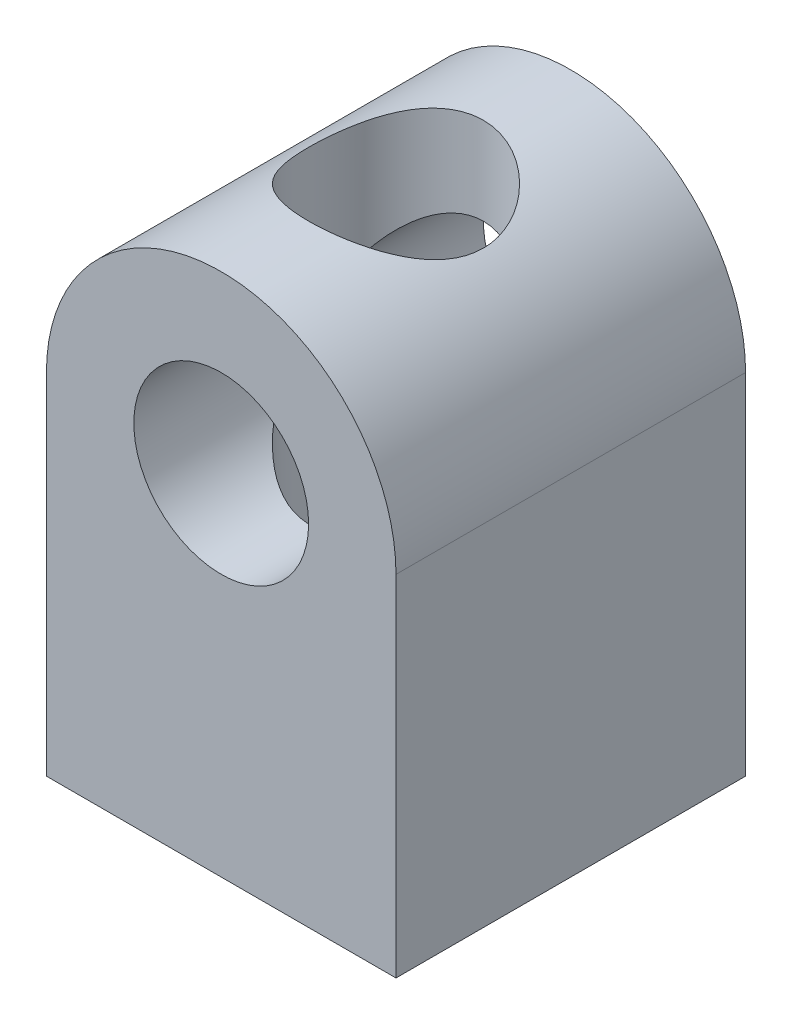
ISO-10303-21;
HEADER;
FILE_DESCRIPTION(('STEP AP214'),'2;1');
FILE_NAME('part.step','',(''),(''),'','','');
FILE_SCHEMA(('AUTOMOTIVE_DESIGN { 1 0 10303 214 1 1 1 1 }'));
ENDSEC;
DATA;
#1=APPLICATION_CONTEXT('core data for automotive mechanical design processes');
#2=APPLICATION_PROTOCOL_DEFINITION('international standard','automotive_design',2000,#1);
#3=PRODUCT_CONTEXT('',#1,'mechanical');
#4=PRODUCT('Part','Part','',(#3));
#5=PRODUCT_RELATED_PRODUCT_CATEGORY('part','',(#4));
#6=PRODUCT_DEFINITION_FORMATION('','',#4);
#7=PRODUCT_DEFINITION_CONTEXT('part definition',#1,'design');
#8=PRODUCT_DEFINITION('design','',#6,#7);
#9=PRODUCT_DEFINITION_SHAPE('','',#8);
#10=(LENGTH_UNIT() NAMED_UNIT(*) SI_UNIT(.MILLI.,.METRE.));
#11=(NAMED_UNIT(*) PLANE_ANGLE_UNIT() SI_UNIT($,.RADIAN.));
#12=(NAMED_UNIT(*) SI_UNIT($,.STERADIAN.) SOLID_ANGLE_UNIT());
#13=UNCERTAINTY_MEASURE_WITH_UNIT(LENGTH_MEASURE(1.E-05),#10,'distance_accuracy_value','');
#14=(GEOMETRIC_REPRESENTATION_CONTEXT(3) GLOBAL_UNCERTAINTY_ASSIGNED_CONTEXT((#13)) GLOBAL_UNIT_ASSIGNED_CONTEXT((#10,
#11,#12)) REPRESENTATION_CONTEXT('',''));
#15=CARTESIAN_POINT('',(0.,0.,0.));
#16=DIRECTION('',(0.,0.,1.));
#17=DIRECTION('',(1.,0.,0.));
#18=AXIS2_PLACEMENT_3D('',#15,#16,#17);
#19=CARTESIAN_POINT('',(0.,0.,5.));
#20=DIRECTION('',(0.,0.,-1.));
#21=DIRECTION('',(-1.,0.,0.));
#22=AXIS2_PLACEMENT_3D('',#19,#20,#21);
#23=CYLINDRICAL_SURFACE('',#22,1.25);
#24=CARTESIAN_POINT('',(0.,0.,2.5));
#25=DIRECTION('',(0.,-0.707106781186547,-0.707106781186547));
#26=DIRECTION('',(0.,0.707106781186547,-0.707106781186547));
#27=AXIS2_PLACEMENT_3D('',#24,#25,#26);
#28=ELLIPSE('',#27,1.76776695296637,1.25);
#29=CARTESIAN_POINT('',(-1.25,0.,2.5));
#30=VERTEX_POINT('',#29);
#31=CARTESIAN_POINT('',(1.25,0.,2.5));
#32=VERTEX_POINT('',#31);
#33=EDGE_CURVE('E11',#30,#32,#28,.F.);
#34=ORIENTED_EDGE('',*,*,#33,.F.);
#35=CARTESIAN_POINT('',(0.,0.,2.5));
#36=DIRECTION('',(0.,0.707106781186547,-0.707106781186547));
#37=DIRECTION('',(0.,-0.707106781186547,-0.707106781186547));
#38=AXIS2_PLACEMENT_3D('',#35,#36,#37);
#39=ELLIPSE('',#38,1.76776695296637,1.25);
#40=EDGE_CURVE('E55',#32,#30,#39,.F.);
#41=ORIENTED_EDGE('',*,*,#40,.F.);
#42=EDGE_LOOP('',(#34,#41));
#43=FACE_BOUND('',#42,.T.);
#44=CARTESIAN_POINT('',(0.,0.,5.));
#45=DIRECTION('',(0.,0.,1.));
#46=DIRECTION('',(1.,0.,0.));
#47=AXIS2_PLACEMENT_3D('',#44,#45,#46);
#48=CIRCLE('',#47,1.25);
#49=CARTESIAN_POINT('',(1.25,0.,5.));
#50=VERTEX_POINT('',#49);
#51=EDGE_CURVE('E128',#50,#50,#48,.T.);
#52=ORIENTED_EDGE('',*,*,#51,.T.);
#53=EDGE_LOOP('',(#52));
#54=FACE_BOUND('',#53,.T.);
#55=ADVANCED_FACE('F40',(#43,#54),#23,.F.);
#56=CARTESIAN_POINT('',(2.5,0.,5.));
#57=DIRECTION('',(-1.,0.,0.));
#58=DIRECTION('',(0.,0.,1.));
#59=AXIS2_PLACEMENT_3D('',#56,#57,#58);
#60=PLANE('',#59);
#61=DIRECTION('',(0.,1.,0.));
#62=VECTOR('',#61,1.);
#63=CARTESIAN_POINT('',(2.5,0.,0.));
#64=LINE('',#63,#62);
#65=CARTESIAN_POINT('',(2.5,-5.,0.));
#66=VERTEX_POINT('',#65);
#67=CARTESIAN_POINT('',(2.5,0.,0.));
#68=VERTEX_POINT('',#67);
#69=EDGE_CURVE('E142',#66,#68,#64,.T.);
#70=ORIENTED_EDGE('',*,*,#69,.T.);
#71=DIRECTION('',(0.,0.,-1.));
#72=VECTOR('',#71,1.);
#73=CARTESIAN_POINT('',(2.5,0.,5.));
#74=LINE('',#73,#72);
#75=CARTESIAN_POINT('',(2.5,0.,5.));
#76=VERTEX_POINT('',#75);
#77=EDGE_CURVE('E109',#76,#68,#74,.T.);
#78=ORIENTED_EDGE('',*,*,#77,.F.);
#79=DIRECTION('',(0.,1.,0.));
#80=VECTOR('',#79,1.);
#81=CARTESIAN_POINT('',(2.5,0.,5.));
#82=LINE('',#81,#80);
#83=CARTESIAN_POINT('',(2.5,-5.,5.));
#84=VERTEX_POINT('',#83);
#85=EDGE_CURVE('E133',#84,#76,#82,.T.);
#86=ORIENTED_EDGE('',*,*,#85,.F.);
#87=DIRECTION('',(0.,0.,-1.));
#88=VECTOR('',#87,1.);
#89=CARTESIAN_POINT('',(2.5,-5.,5.));
#90=LINE('',#89,#88);
#91=EDGE_CURVE('E125',#84,#66,#90,.T.);
#92=ORIENTED_EDGE('',*,*,#91,.T.);
#93=EDGE_LOOP('',(#70,#78,#86,#92));
#94=FACE_BOUND('',#93,.T.);
#95=ADVANCED_FACE('F42',(#94),#60,.F.);
#96=CARTESIAN_POINT('',(0.,0.,5.));
#97=DIRECTION('',(0.,0.,-1.));
#98=DIRECTION('',(-1.,0.,0.));
#99=AXIS2_PLACEMENT_3D('',#96,#97,#98);
#100=CYLINDRICAL_SURFACE('',#99,2.5);
#101=CARTESIAN_POINT('',(0.,2.5,1.25));
#102=CARTESIAN_POINT('',(0.0657149536912331,2.49999641755189,1.25000412789938));
#103=CARTESIAN_POINT('',(0.131508249622541,2.49738113774397,1.25521259140209));
#104=CARTESIAN_POINT('',(0.261150294085531,2.48717695046745,1.27581610042615));
#105=CARTESIAN_POINT('',(0.324995108391879,2.47957859786229,1.29123049124706));
#106=CARTESIAN_POINT('',(0.448666931100718,2.46020349254139,1.33149226077099));
#107=CARTESIAN_POINT('',(0.508508503673975,2.448442989719,1.35630298031002));
#108=CARTESIAN_POINT('',(0.623090771008206,2.42182220644723,1.41446327670618));
#109=CARTESIAN_POINT('',(0.677831867487562,2.40696217041913,1.44781218031107));
#110=CARTESIAN_POINT('',(0.784384772202399,2.37445322822571,1.52439656185662));
#111=CARTESIAN_POINT('',(0.83581901390264,2.3566899890942,1.56810809904955));
#112=CARTESIAN_POINT('',(0.930974306083722,2.3207496280843,1.66315184905879));
#113=CARTESIAN_POINT('',(0.974689478883458,2.30257220261294,1.71448981471555));
#114=CARTESIAN_POINT('',(1.05656500056285,2.26623688996684,1.82810418690423));
#115=CARTESIAN_POINT('',(1.09403166943955,2.24818983712665,1.89092012293239));
#116=CARTESIAN_POINT('',(1.15771028361337,2.21607473465401,2.02295916998277));
#117=CARTESIAN_POINT('',(1.18393026870792,2.20200384508737,2.09217766090344));
#118=CARTESIAN_POINT('',(1.22266555273574,2.18072333797261,2.2308313817774));
#119=CARTESIAN_POINT('',(1.23590732135055,2.17315339479642,2.30000556508424));
#120=CARTESIAN_POINT('',(1.25053374163606,2.1647736243566,2.43997354722435));
#121=CARTESIAN_POINT('',(1.25193011046634,2.1639571167911,2.51076567608894));
#122=CARTESIAN_POINT('',(1.24335910896537,2.16888662821561,2.64285753039421));
#123=CARTESIAN_POINT('',(1.23473069942103,2.17385954577517,2.70428003902881));
#124=CARTESIAN_POINT('',(1.20867481132117,2.18845285917313,2.8246523867163));
#125=CARTESIAN_POINT('',(1.19124452987206,2.1980747353972,2.88360143163164));
#126=CARTESIAN_POINT('',(1.1477622254825,2.22109345515926,2.99903641570707));
#127=CARTESIAN_POINT('',(1.12151883389499,2.23457300829998,3.05543299848224));
#128=CARTESIAN_POINT('',(1.061302109585,2.26379255351755,3.16329286573751));
#129=CARTESIAN_POINT('',(1.02732530476558,2.27953355975238,3.21475391950011));
#130=CARTESIAN_POINT('',(0.947582568640986,2.31391447379107,3.31815156592903));
#131=CARTESIAN_POINT('',(0.900868072961602,2.33266887795933,3.3693210919702));
#132=CARTESIAN_POINT('',(0.799444473426717,2.36934529125509,3.46341927323863));
#133=CARTESIAN_POINT('',(0.744731570717857,2.38726689948501,3.50634399004235));
#134=CARTESIAN_POINT('',(0.625645632289811,2.42127484103705,3.58460707628716));
#135=CARTESIAN_POINT('',(0.560941989499261,2.43723730202509,3.61950059055718));
#136=CARTESIAN_POINT('',(0.425582769360996,2.46447351401553,3.67762128630376));
#137=CARTESIAN_POINT('',(0.354931970331596,2.47575098679441,3.70085773126896));
#138=CARTESIAN_POINT('',(0.215958114575877,2.49155417176795,3.73309425464584));
#139=CARTESIAN_POINT('',(0.147926913185405,2.4965617287664,3.74311404468347));
#140=CARTESIAN_POINT('',(0.0109744999366919,2.50091266823877,3.75183091391811));
#141=CARTESIAN_POINT('',(-0.0579462748373769,2.5002587340164,3.75053335704935));
#142=CARTESIAN_POINT('',(-0.189041214982492,2.49363990316801,3.73724163947656));
#143=CARTESIAN_POINT('',(-0.251324260062443,2.48809057110237,3.72608433408746));
#144=CARTESIAN_POINT('',(-0.373008615377396,2.47277714143524,3.69470241013114));
#145=CARTESIAN_POINT('',(-0.432409607113746,2.46301257917916,3.6744767919333));
#146=CARTESIAN_POINT('',(-0.548610760562082,2.43980314267087,3.62500191695854));
#147=CARTESIAN_POINT('',(-0.605287996257692,2.42626102212424,3.59551118735398));
#148=CARTESIAN_POINT('',(-0.713076702123651,2.39679967896386,3.52861558044245));
#149=CARTESIAN_POINT('',(-0.764185787219103,2.38087944457231,3.49120733175821));
#150=CARTESIAN_POINT('',(-0.864709611613317,2.3463527667183,3.40529946833391));
#151=CARTESIAN_POINT('',(-0.913465097280799,2.32763606060552,3.35607141443304));
#152=CARTESIAN_POINT('',(-1.00232040139155,2.29077989504843,3.25009356091337));
#153=CARTESIAN_POINT('',(-1.04241423211355,2.27264084226908,3.19333860147953));
#154=CARTESIAN_POINT('',(-1.11463489312212,2.23813990282585,3.07044543224961));
#155=CARTESIAN_POINT('',(-1.1462818698483,2.2219066207934,3.00398591723926));
#156=CARTESIAN_POINT('',(-1.19760353251725,2.19467590460158,2.86561241538435));
#157=CARTESIAN_POINT('',(-1.21729364485946,2.18367172800773,2.79370559187352));
#158=CARTESIAN_POINT('',(-1.2423271093121,2.16951876260833,2.65386222142319));
#159=CARTESIAN_POINT('',(-1.24886624550108,2.16571729325614,2.58620718321371));
#160=CARTESIAN_POINT('',(-1.25086144297598,2.16456693307719,2.45069116603659));
#161=CARTESIAN_POINT('',(-1.2463223082805,2.16721524534441,2.38283028907571));
#162=CARTESIAN_POINT('',(-1.22740765699033,2.17797327562531,2.25564562308498));
#163=CARTESIAN_POINT('',(-1.2140103929285,2.18553868102992,2.1961244123195));
#164=CARTESIAN_POINT('',(-1.17896919778081,2.20463770234897,2.08023985071912));
#165=CARTESIAN_POINT('',(-1.15732261394976,2.21617259462095,2.02387752238504));
#166=CARTESIAN_POINT('',(-1.10476968162585,2.2428566295566,1.91171893626674));
#167=CARTESIAN_POINT('',(-1.07333892227057,2.25819652995238,1.85621512271287));
#168=CARTESIAN_POINT('',(-1.00268871454579,2.29044164543238,1.75090682977427));
#169=CARTESIAN_POINT('',(-0.96346521404831,2.30734767243153,1.70110533685189));
#170=CARTESIAN_POINT('',(-0.872754158330801,2.34327903949141,1.60232252205298));
#171=CARTESIAN_POINT('',(-0.820355528762714,2.36231229139336,1.5541761220476));
#172=CARTESIAN_POINT('',(-0.70769350777535,2.3984719031886,1.46717127072046));
#173=CARTESIAN_POINT('',(-0.647425904070981,2.4155972326005,1.42831782571714));
#174=CARTESIAN_POINT('',(-0.519914496024933,2.44622511981379,1.36095454654724));
#175=CARTESIAN_POINT('',(-0.452624379918268,2.45970120703636,1.33251978823571));
#176=CARTESIAN_POINT('',(-0.313427626617739,2.48126676704332,1.28773979010131));
#177=CARTESIAN_POINT('',(-0.241534749528957,2.48937154216165,1.27136019146303));
#178=CARTESIAN_POINT('',(-0.140752433104229,2.49619327387079,1.25762823615519));
#179=CARTESIAN_POINT('',(-0.112702349299373,2.49761706674002,1.25477169892048));
#180=CARTESIAN_POINT('',(-0.056439664758947,2.49952121222331,1.25095666810399));
#181=CARTESIAN_POINT('',(-0.0282270595592267,2.50000153879704,1.249998226911));
#182=CARTESIAN_POINT('',(0.,2.5,1.25));
#183=B_SPLINE_CURVE_WITH_KNOTS('',3,(#101,#102,#103,#104,#105,#106,#107,#108,#109,#110,#111,
#112,#113,#114,#115,#116,#117,#118,#119,#120,#121,#122,#123,#124,#125,#126,#127,#128,#129,#130,
#131,#132,#133,#134,#135,#136,#137,#138,#139,#140,#141,#142,#143,#144,#145,#146,#147,#148,#149,
#150,#151,#152,#153,#154,#155,#156,#157,#158,#159,#160,#161,#162,#163,#164,#165,#166,#167,#168,
#169,#170,#171,#172,#173,#174,#175,#176,#177,#178,#179,#180,#181,#182),.UNSPECIFIED.,.T.,.F.,(4,
2,2,2,2,2,2,2,2,2,2,2,2,2,2,2,2,2,2,2,2,2,2,2,2,2,2,2,2,2,2,2,2,2,2,2,2,2,2,2,4),(0.,
0.197030321775366,0.394435187136497,0.591077694365373,0.78770470072696,0.996227198397611,
1.20490779706754,1.42977158038441,1.65447434872851,1.86572515175287,2.07676696661276,
2.26257140511651,2.44843504907098,2.63862800210609,2.82890651575277,3.04331176667348,
3.25781918248358,3.48228777768051,3.70657771140349,3.91229113089182,4.11790705639345,
4.30758633132653,4.49728652038664,4.69241070034873,4.88761813435424,5.10199513305523,
5.3165198576929,5.54143352699592,5.76605639925972,5.96911634372967,6.17208824825007,
6.35572412805228,6.53941910979597,6.73545570969518,6.93159451423697,7.15156553440623,
7.37165479220716,7.59330017078656,7.81431135781163,7.89894100172122,7.98357298143558),.UNSPECIFIED.);
#184=CARTESIAN_POINT('',(0.,2.5,1.25));
#185=VERTEX_POINT('',#184);
#186=EDGE_CURVE('E146',#185,#185,#183,.T.);
#187=ORIENTED_EDGE('',*,*,#186,.T.);
#188=EDGE_LOOP('',(#187));
#189=FACE_BOUND('',#188,.T.);
#190=CARTESIAN_POINT('',(0.,0.,0.));
#191=DIRECTION('',(0.,0.,1.));
#192=DIRECTION('',(1.,0.,0.));
#193=AXIS2_PLACEMENT_3D('',#190,#191,#192);
#194=CIRCLE('',#193,2.5);
#195=CARTESIAN_POINT('',(-2.5,0.,0.));
#196=VERTEX_POINT('',#195);
#197=EDGE_CURVE('E139',#68,#196,#194,.T.);
#198=ORIENTED_EDGE('',*,*,#197,.T.);
#199=DIRECTION('',(0.,0.,-1.));
#200=VECTOR('',#199,1.);
#201=CARTESIAN_POINT('',(-2.5,0.,5.));
#202=LINE('',#201,#200);
#203=CARTESIAN_POINT('',(-2.5,0.,5.));
#204=VERTEX_POINT('',#203);
#205=EDGE_CURVE('E118',#204,#196,#202,.T.);
#206=ORIENTED_EDGE('',*,*,#205,.F.);
#207=CARTESIAN_POINT('',(0.,0.,5.));
#208=DIRECTION('',(0.,0.,1.));
#209=DIRECTION('',(1.,0.,0.));
#210=AXIS2_PLACEMENT_3D('',#207,#208,#209);
#211=CIRCLE('',#210,2.5);
#212=EDGE_CURVE('E93',#76,#204,#211,.T.);
#213=ORIENTED_EDGE('',*,*,#212,.F.);
#214=ORIENTED_EDGE('',*,*,#77,.T.);
#215=EDGE_LOOP('',(#198,#206,#213,#214));
#216=FACE_BOUND('',#215,.T.);
#217=ADVANCED_FACE('F167',(#189,#216),#100,.T.);
#218=CARTESIAN_POINT('',(-2.5,0.,5.));
#219=DIRECTION('',(1.,0.,0.));
#220=DIRECTION('',(0.,0.,-1.));
#221=AXIS2_PLACEMENT_3D('',#218,#219,#220);
#222=PLANE('',#221);
#223=DIRECTION('',(0.,-1.,0.));
#224=VECTOR('',#223,1.);
#225=CARTESIAN_POINT('',(-2.5,0.,0.));
#226=LINE('',#225,#224);
#227=CARTESIAN_POINT('',(-2.5,-5.,0.));
#228=VERTEX_POINT('',#227);
#229=EDGE_CURVE('E136',#196,#228,#226,.T.);
#230=ORIENTED_EDGE('',*,*,#229,.T.);
#231=DIRECTION('',(0.,0.,-1.));
#232=VECTOR('',#231,1.);
#233=CARTESIAN_POINT('',(-2.5,-5.,5.));
#234=LINE('',#233,#232);
#235=CARTESIAN_POINT('',(-2.5,-5.,5.));
#236=VERTEX_POINT('',#235);
#237=EDGE_CURVE('E122',#236,#228,#234,.T.);
#238=ORIENTED_EDGE('',*,*,#237,.F.);
#239=DIRECTION('',(0.,-1.,0.));
#240=VECTOR('',#239,1.);
#241=CARTESIAN_POINT('',(-2.5,0.,5.));
#242=LINE('',#241,#240);
#243=EDGE_CURVE('E152',#204,#236,#242,.T.);
#244=ORIENTED_EDGE('',*,*,#243,.F.);
#245=ORIENTED_EDGE('',*,*,#205,.T.);
#246=EDGE_LOOP('',(#230,#238,#244,#245));
#247=FACE_BOUND('',#246,.T.);
#248=ADVANCED_FACE('F184',(#247),#222,.F.);
#249=CARTESIAN_POINT('',(0.,-5.,5.));
#250=DIRECTION('',(0.,1.,0.));
#251=DIRECTION('',(0.,0.,1.));
#252=AXIS2_PLACEMENT_3D('',#249,#250,#251);
#253=PLANE('',#252);
#254=CARTESIAN_POINT('',(0.,-5.,2.5));
#255=DIRECTION('',(0.,-1.,0.));
#256=DIRECTION('',(0.,0.,-1.));
#257=AXIS2_PLACEMENT_3D('',#254,#255,#256);
#258=CIRCLE('',#257,1.25);
#259=CARTESIAN_POINT('',(0.,-5.,1.25));
#260=VERTEX_POINT('',#259);
#261=EDGE_CURVE('E166',#260,#260,#258,.T.);
#262=ORIENTED_EDGE('',*,*,#261,.F.);
#263=EDGE_LOOP('',(#262));
#264=FACE_BOUND('',#263,.T.);
#265=DIRECTION('',(1.,0.,0.));
#266=VECTOR('',#265,1.);
#267=CARTESIAN_POINT('',(0.,-5.,0.));
#268=LINE('',#267,#266);
#269=EDGE_CURVE('E85',#228,#66,#268,.T.);
#270=ORIENTED_EDGE('',*,*,#269,.T.);
#271=ORIENTED_EDGE('',*,*,#91,.F.);
#272=DIRECTION('',(1.,0.,0.));
#273=VECTOR('',#272,1.);
#274=CARTESIAN_POINT('',(0.,-5.,5.));
#275=LINE('',#274,#273);
#276=EDGE_CURVE('E64',#236,#84,#275,.T.);
#277=ORIENTED_EDGE('',*,*,#276,.F.);
#278=ORIENTED_EDGE('',*,*,#237,.T.);
#279=EDGE_LOOP('',(#270,#271,#277,#278));
#280=FACE_BOUND('',#279,.T.);
#281=ADVANCED_FACE('F182',(#264,#280),#253,.F.);
#282=CARTESIAN_POINT('',(0.,0.,2.5));
#283=DIRECTION('',(0.,-0.707106781186547,-0.707106781186547));
#284=DIRECTION('',(0.,0.707106781186547,-0.707106781186547));
#285=AXIS2_PLACEMENT_3D('',#282,#283,#284);
#286=ELLIPSE('',#285,1.76776695296637,1.25);
#287=EDGE_CURVE('E49',#30,#32,#286,.T.);
#288=ORIENTED_EDGE('',*,*,#287,.F.);
#289=CARTESIAN_POINT('',(0.,0.,2.5));
#290=DIRECTION('',(0.,0.707106781186547,-0.707106781186547));
#291=DIRECTION('',(0.,-0.707106781186547,-0.707106781186547));
#292=AXIS2_PLACEMENT_3D('',#289,#290,#291);
#293=ELLIPSE('',#292,1.76776695296637,1.25);
#294=EDGE_CURVE('E98',#32,#30,#293,.T.);
#295=ORIENTED_EDGE('',*,*,#294,.F.);
#296=EDGE_LOOP('',(#288,#295));
#297=FACE_BOUND('',#296,.T.);
#298=CARTESIAN_POINT('',(0.,0.,0.));
#299=DIRECTION('',(0.,0.,1.));
#300=DIRECTION('',(1.,0.,0.));
#301=AXIS2_PLACEMENT_3D('',#298,#299,#300);
#302=CIRCLE('',#301,1.25);
#303=CARTESIAN_POINT('',(1.25,0.,0.));
#304=VERTEX_POINT('',#303);
#305=EDGE_CURVE('E129',#304,#304,#302,.T.);
#306=ORIENTED_EDGE('',*,*,#305,.F.);
#307=EDGE_LOOP('',(#306));
#308=FACE_BOUND('',#307,.T.);
#309=ADVANCED_FACE('F112',(#297,#308),#23,.F.);
#310=CARTESIAN_POINT('',(0.,0.,5.));
#311=DIRECTION('',(0.,0.,1.));
#312=DIRECTION('',(1.,0.,0.));
#313=AXIS2_PLACEMENT_3D('',#310,#311,#312);
#314=PLANE('',#313);
#315=ORIENTED_EDGE('',*,*,#85,.T.);
#316=ORIENTED_EDGE('',*,*,#212,.T.);
#317=ORIENTED_EDGE('',*,*,#243,.T.);
#318=ORIENTED_EDGE('',*,*,#276,.T.);
#319=EDGE_LOOP('',(#315,#316,#317,#318));
#320=FACE_BOUND('',#319,.T.);
#321=ORIENTED_EDGE('',*,*,#51,.F.);
#322=EDGE_LOOP('',(#321));
#323=FACE_BOUND('',#322,.T.);
#324=ADVANCED_FACE('F173',(#320,#323),#314,.T.);
#325=CARTESIAN_POINT('',(0.,0.,0.));
#326=DIRECTION('',(0.,0.,1.));
#327=DIRECTION('',(1.,0.,0.));
#328=AXIS2_PLACEMENT_3D('',#325,#326,#327);
#329=PLANE('',#328);
#330=ORIENTED_EDGE('',*,*,#69,.F.);
#331=ORIENTED_EDGE('',*,*,#269,.F.);
#332=ORIENTED_EDGE('',*,*,#229,.F.);
#333=ORIENTED_EDGE('',*,*,#197,.F.);
#334=EDGE_LOOP('',(#330,#331,#332,#333));
#335=FACE_BOUND('',#334,.T.);
#336=ORIENTED_EDGE('',*,*,#305,.T.);
#337=EDGE_LOOP('',(#336));
#338=FACE_BOUND('',#337,.T.);
#339=ADVANCED_FACE('F176',(#335,#338),#329,.F.);
#340=CARTESIAN_POINT('',(0.,2.5,2.5));
#341=DIRECTION('',(0.,-1.,0.));
#342=DIRECTION('',(0.,0.,-1.));
#343=AXIS2_PLACEMENT_3D('',#340,#341,#342);
#344=CYLINDRICAL_SURFACE('',#343,1.25);
#345=ORIENTED_EDGE('',*,*,#287,.T.);
#346=ORIENTED_EDGE('',*,*,#40,.T.);
#347=EDGE_LOOP('',(#345,#346));
#348=FACE_BOUND('',#347,.T.);
#349=ORIENTED_EDGE('',*,*,#186,.F.);
#350=EDGE_LOOP('',(#349));
#351=FACE_BOUND('',#350,.T.);
#352=ADVANCED_FACE('F106',(#348,#351),#344,.F.);
#353=ORIENTED_EDGE('',*,*,#33,.T.);
#354=ORIENTED_EDGE('',*,*,#294,.T.);
#355=EDGE_LOOP('',(#353,#354));
#356=FACE_BOUND('',#355,.T.);
#357=ORIENTED_EDGE('',*,*,#261,.T.);
#358=EDGE_LOOP('',(#357));
#359=FACE_BOUND('',#358,.T.);
#360=ADVANCED_FACE('F99',(#356,#359),#344,.F.);
#361=CLOSED_SHELL('',(#55,#95,#217,#248,#281,#309,#324,#339,#352,#360));
#362=MANIFOLD_SOLID_BREP('B2',#361);
#363=ADVANCED_BREP_SHAPE_REPRESENTATION('',(#18,#362),#14);
#364=SHAPE_DEFINITION_REPRESENTATION(#9,#363);
ENDSEC;
END-ISO-10303-21;
